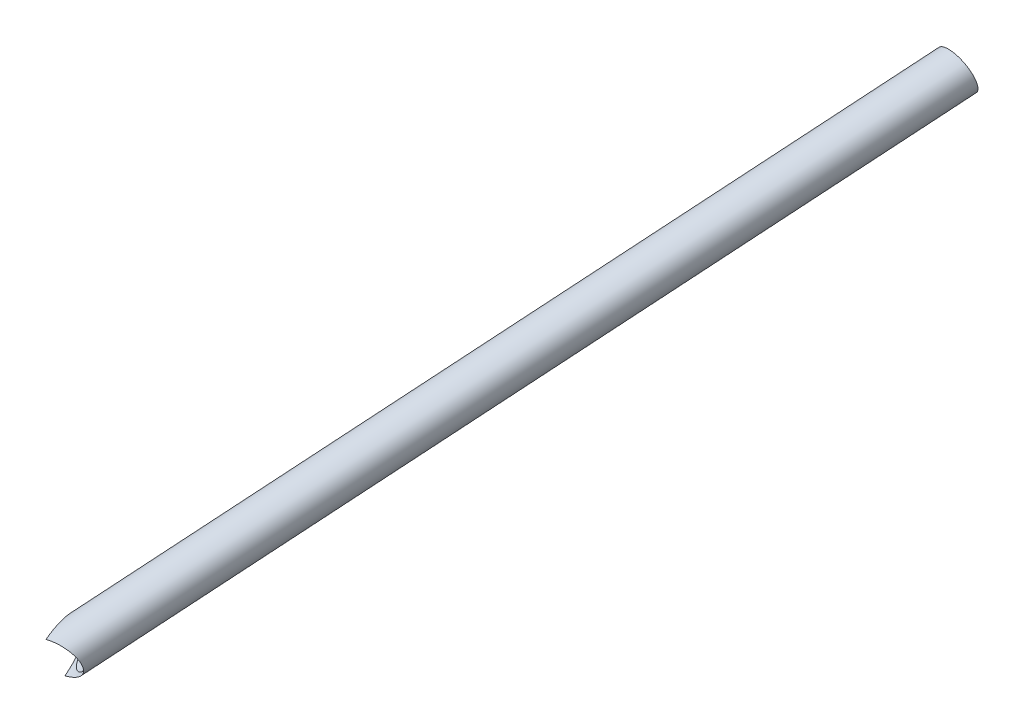
ISO-10303-21;
HEADER;
FILE_DESCRIPTION(('STEP AP214'),'2;1');
FILE_NAME('part.step','',(''),(''),'','','');
FILE_SCHEMA(('AUTOMOTIVE_DESIGN { 1 0 10303 214 1 1 1 1 }'));
ENDSEC;
DATA;
#1=APPLICATION_CONTEXT('core data for automotive mechanical design processes');
#2=APPLICATION_PROTOCOL_DEFINITION('international standard','automotive_design',2000,#1);
#3=PRODUCT_CONTEXT('',#1,'mechanical');
#4=PRODUCT('Part','Part','',(#3));
#5=PRODUCT_RELATED_PRODUCT_CATEGORY('part','',(#4));
#6=PRODUCT_DEFINITION_FORMATION('','',#4);
#7=PRODUCT_DEFINITION_CONTEXT('part definition',#1,'design');
#8=PRODUCT_DEFINITION('design','',#6,#7);
#9=PRODUCT_DEFINITION_SHAPE('','',#8);
#10=(LENGTH_UNIT() NAMED_UNIT(*) SI_UNIT(.MILLI.,.METRE.));
#11=(NAMED_UNIT(*) PLANE_ANGLE_UNIT() SI_UNIT($,.RADIAN.));
#12=(NAMED_UNIT(*) SI_UNIT($,.STERADIAN.) SOLID_ANGLE_UNIT());
#13=UNCERTAINTY_MEASURE_WITH_UNIT(LENGTH_MEASURE(1.E-05),#10,'distance_accuracy_value','');
#14=(GEOMETRIC_REPRESENTATION_CONTEXT(3) GLOBAL_UNCERTAINTY_ASSIGNED_CONTEXT((#13)) GLOBAL_UNIT_ASSIGNED_CONTEXT((#10,
#11,#12)) REPRESENTATION_CONTEXT('',''));
#15=CARTESIAN_POINT('',(0.,0.,0.));
#16=DIRECTION('',(0.,0.,1.));
#17=DIRECTION('',(1.,0.,0.));
#18=AXIS2_PLACEMENT_3D('',#15,#16,#17);
#19=CARTESIAN_POINT('',(-225.,199.999999999997,-200.000000000001));
#20=DIRECTION('',(0.313257210262408,0.388871019636107,-0.866400167535642));
#21=DIRECTION('',(0.,0.912318699307087,0.40948087976684));
#22=AXIS2_PLACEMENT_3D('',#19,#20,#21);
#23=CYLINDRICAL_SURFACE('',#22,11.3);
#24=CARTESIAN_POINT('',(-80.0000000000003,380.000000000003,-601.037933611911));
#25=DIRECTION('',(0.0877040448988896,0.311824264686706,-0.946083309471723));
#26=DIRECTION('',(0.915766996856783,0.348518707826596,0.199763654759292));
#27=AXIS2_PLACEMENT_3D('',#24,#25,#26);
#28=ELLIPSE('',#27,11.6684899557684,11.3);
#29=CARTESIAN_POINT('',(-69.3143819953527,384.066687041675,-598.706993412824));
#30=VERTEX_POINT('',#29);
#31=EDGE_CURVE('E85',#30,#30,#28,.T.);
#32=ORIENTED_EDGE('',*,*,#31,.T.);
#33=EDGE_LOOP('',(#32));
#34=FACE_BOUND('',#33,.T.);
#35=CARTESIAN_POINT('',(-223.170681683834,212.580079211889,-200.43235597197));
#36=CARTESIAN_POINT('',(-223.342960242135,212.642900551134,-200.572308157806));
#37=CARTESIAN_POINT('',(-223.5063247625,212.704324340843,-200.72371246689));
#38=CARTESIAN_POINT('',(-223.815345767516,212.824369890079,-201.044765475674));
#39=CARTESIAN_POINT('',(-223.960983559026,212.882988652811,-201.214433085204));
#40=CARTESIAN_POINT('',(-224.236946514407,212.997663034725,-201.568606781049));
#41=CARTESIAN_POINT('',(-224.367149546055,213.053696310919,-201.753213975834));
#42=CARTESIAN_POINT('',(-224.613304656625,213.16261224097,-202.132409583786));
#43=CARTESIAN_POINT('',(-224.729259438125,213.215495491333,-202.326996094142));
#44=CARTESIAN_POINT('',(-224.97188589708,213.328537163043,-202.764131330896));
#45=CARTESIAN_POINT('',(-225.095886166926,213.387966386511,-203.008338811169));
#46=CARTESIAN_POINT('',(-225.330339153318,213.501989809347,-203.504330851236));
#47=CARTESIAN_POINT('',(-225.440784919299,213.556581524151,-203.756119216677));
#48=CARTESIAN_POINT('',(-225.651055297934,213.66081127532,-204.265605322309));
#49=CARTESIAN_POINT('',(-225.750860548779,213.710440271522,-204.523312831738));
#50=CARTESIAN_POINT('',(-225.94174101524,213.804418331292,-205.042808607497));
#51=CARTESIAN_POINT('',(-226.032817837557,213.84876836696,-205.304596112441));
#52=CARTESIAN_POINT('',(-226.208199036787,213.932126681191,-205.832398121217));
#53=CARTESIAN_POINT('',(-226.292476119537,213.971113835275,-206.098424980178));
#54=CARTESIAN_POINT('',(-226.455083330722,214.043280955442,-206.633074079074));
#55=CARTESIAN_POINT('',(-226.53341324828,214.07646071566,-206.90169641066));
#56=CARTESIAN_POINT('',(-226.684950479747,214.136680179376,-207.440743663664));
#57=CARTESIAN_POINT('',(-226.758163270196,214.16372651892,-207.711166307874));
#58=CARTESIAN_POINT('',(-226.900244887483,214.211391119115,-208.253729450513));
#59=CARTESIAN_POINT('',(-226.969113456219,214.23200899812,-208.525870049955));
#60=CARTESIAN_POINT('',(-227.107894261879,214.267691121499,-209.091412827201));
#61=CARTESIAN_POINT('',(-227.17751664929,214.282240993876,-209.384918836055));
#62=CARTESIAN_POINT('',(-227.312811655067,214.302972285788,-209.973159587268));
#63=CARTESIAN_POINT('',(-227.37848398089,214.309153086232,-210.267894418911));
#64=CARTESIAN_POINT('',(-227.506236823727,214.312534083165,-210.858396063157));
#65=CARTESIAN_POINT('',(-227.568315011136,214.309728519881,-211.154163416209));
#66=CARTESIAN_POINT('',(-227.689037869115,214.294418618149,-211.746124910376));
#67=CARTESIAN_POINT('',(-227.747682874509,214.281915227192,-212.042319006978));
#68=CARTESIAN_POINT('',(-227.861328077719,214.246495111186,-212.633012524707));
#69=CARTESIAN_POINT('',(-227.916347378792,214.223638976933,-212.927511848309));
#70=CARTESIAN_POINT('',(-228.023123854569,214.166599795624,-213.5159803541));
#71=CARTESIAN_POINT('',(-228.07488143364,214.132418155933,-213.8099495976));
#72=CARTESIAN_POINT('',(-228.175036845002,214.05166891956,-214.39652452381));
#73=CARTESIAN_POINT('',(-228.22343735236,214.005111330958,-214.689131114776));
#74=CARTESIAN_POINT('',(-228.316762336355,213.898335938604,-215.272364160373));
#75=CARTESIAN_POINT('',(-228.36168756773,213.838121112078,-215.562991032372));
#76=CARTESIAN_POINT('',(-228.440020542061,213.714814311806,-216.088916059171));
#77=CARTESIAN_POINT('',(-228.474041090138,213.654216136427,-216.324706804013));
#78=CARTESIAN_POINT('',(-228.539389818938,213.521922179066,-216.79353892662));
#79=CARTESIAN_POINT('',(-228.570718166215,213.450227084372,-217.026580473696));
#80=CARTESIAN_POINT('',(-228.630478043049,213.294568365427,-217.489345454793));
#81=CARTESIAN_POINT('',(-228.658904960884,213.210585710604,-217.719063123207));
#82=CARTESIAN_POINT('',(-228.71248472308,213.02927178271,-218.173598072011));
#83=CARTESIAN_POINT('',(-228.737637524947,212.93194033642,-218.398415288767));
#84=CARTESIAN_POINT('',(-228.784527654986,212.721532920552,-218.844025676543));
#85=CARTESIAN_POINT('',(-228.806224458169,212.608295842474,-219.06474758059));
#86=CARTESIAN_POINT('',(-228.845373301333,212.365568087056,-219.497565059594));
#87=CARTESIAN_POINT('',(-228.862824818496,212.236075410772,-219.709659569389));
#88=CARTESIAN_POINT('',(-228.892869738466,211.959944122573,-220.122119384267));
#89=CARTESIAN_POINT('',(-228.905474056623,211.813345015177,-220.322510170728));
#90=CARTESIAN_POINT('',(-228.925244077587,211.501885400407,-220.708841104466));
#91=CARTESIAN_POINT('',(-228.932412681571,211.337034688294,-220.894788912689));
#92=CARTESIAN_POINT('',(-228.939398574621,211.043146661141,-221.193353255568));
#93=CARTESIAN_POINT('',(-228.940811634,210.91898234303,-221.310748531268));
#94=CARTESIAN_POINT('',(-228.940588806732,210.662044687618,-221.535679689023));
#95=CARTESIAN_POINT('',(-228.93895378136,210.529273792444,-221.643218347181));
#96=CARTESIAN_POINT('',(-228.932493540919,210.255608758685,-221.847110997192));
#97=CARTESIAN_POINT('',(-228.927670631953,210.114720559331,-221.943473015));
#98=CARTESIAN_POINT('',(-228.914751243764,209.825422883865,-222.123938003776));
#99=CARTESIAN_POINT('',(-228.906654715854,209.67701329592,-222.208040792393));
#100=CARTESIAN_POINT('',(-228.887140197008,209.373078030602,-222.36331557894));
#101=CARTESIAN_POINT('',(-228.875709945831,209.217527904822,-222.434438242134));
#102=CARTESIAN_POINT('',(-228.84961127769,208.90103169574,-222.562706789619));
#103=CARTESIAN_POINT('',(-228.834942861973,208.740085614519,-222.619852679303));
#104=CARTESIAN_POINT('',(-228.802512163356,208.414066585077,-222.719900984726));
#105=CARTESIAN_POINT('',(-228.784748620116,208.248991979259,-222.762797577376));
#106=CARTESIAN_POINT('',(-228.746347064615,207.916136659426,-222.834407939124));
#107=CARTESIAN_POINT('',(-228.725709017533,207.748355912653,-222.863121536398));
#108=CARTESIAN_POINT('',(-228.682688426654,207.418067217901,-222.905925142407));
#109=CARTESIAN_POINT('',(-228.66040772639,207.255614519192,-222.9205506698));
#110=CARTESIAN_POINT('',(-228.613673234366,206.930358901844,-222.937730676728));
#111=CARTESIAN_POINT('',(-228.589218733852,206.767555885994,-222.940281204473));
#112=CARTESIAN_POINT('',(-228.512977437117,206.280037008397,-222.930912298448));
#113=CARTESIAN_POINT('',(-228.458292533268,205.956057194704,-222.901990817121));
#114=CARTESIAN_POINT('',(-228.303975430701,205.098209724221,-222.772873462301));
#115=CARTESIAN_POINT('',(-228.198960943903,204.570606414374,-222.637698782022));
#116=CARTESIAN_POINT('',(-228.033507162766,203.801954027345,-222.37574393968));
#117=CARTESIAN_POINT('',(-227.976919509919,203.549072857679,-222.278319944784));
#118=CARTESIAN_POINT('',(-227.861504026765,203.051047442892,-222.066462541915));
#119=CARTESIAN_POINT('',(-227.802676667009,202.805901592196,-221.952032692278));
#120=CARTESIAN_POINT('',(-227.638542933763,202.143455461426,-221.61787953157));
#121=CARTESIAN_POINT('',(-227.531299153119,201.734144172336,-221.383285489882));
#122=CARTESIAN_POINT('',(-227.312094123585,200.938360328336,-220.879891269383));
#123=CARTESIAN_POINT('',(-227.200129104218,200.551906643207,-220.611063390933));
#124=CARTESIAN_POINT('',(-226.971564870672,199.799631015759,-220.04562376045));
#125=CARTESIAN_POINT('',(-226.854953172045,199.433872080444,-219.748933782168));
#126=CARTESIAN_POINT('',(-226.617288017231,198.72297308089,-219.133812665823));
#127=CARTESIAN_POINT('',(-226.496236040674,198.377826247074,-218.815388740229));
#128=CARTESIAN_POINT('',(-226.287092252018,197.810282923899,-218.261527509891));
#129=CARTESIAN_POINT('',(-226.20033198394,197.582820905688,-218.030736749171));
#130=CARTESIAN_POINT('',(-226.023979506756,197.136901163313,-217.561627096661));
#131=CARTESIAN_POINT('',(-225.934387120833,196.918444003318,-217.32330773484));
#132=CARTESIAN_POINT('',(-225.751795050186,196.49020971041,-216.839896453059));
#133=CARTESIAN_POINT('',(-225.658792638616,196.280439822894,-216.594799153348));
#134=CARTESIAN_POINT('',(-225.46874903675,195.869722692473,-216.098864339946));
#135=CARTESIAN_POINT('',(-225.371708009643,195.668775093757,-215.848027058375));
#136=CARTESIAN_POINT('',(-225.172913133666,195.276360561313,-215.342132300365));
#137=CARTESIAN_POINT('',(-225.071173710046,195.084867915157,-215.087089109609));
#138=CARTESIAN_POINT('',(-224.86141331789,194.71102459382,-214.572853956956));
#139=CARTESIAN_POINT('',(-224.753391630782,194.528674968886,-214.313661522933));
#140=CARTESIAN_POINT('',(-224.529423762548,194.173961889095,-213.792379342752));
#141=CARTESIAN_POINT('',(-224.413487197619,194.001586770305,-213.53029342565));
#142=CARTESIAN_POINT('',(-224.171141364839,193.667684953005,-213.004112633604));
#143=CARTESIAN_POINT('',(-224.044735342135,193.506154920816,-212.740018404043));
#144=CARTESIAN_POINT('',(-223.821856478748,193.2468237412,-212.298376862104));
#145=CARTESIAN_POINT('',(-223.729218458769,193.145540381184,-212.120942294788));
#146=CARTESIAN_POINT('',(-223.536264365094,192.949523284265,-211.766564881264));
#147=CARTESIAN_POINT('',(-223.435947615263,192.854790125527,-211.589622079783));
#148=CARTESIAN_POINT('',(-223.226083929592,192.673155563582,-211.237361735224));
#149=CARTESIAN_POINT('',(-223.116543896414,192.58624840249,-211.062043083821));
#150=CARTESIAN_POINT('',(-222.886279568542,192.421875613855,-210.714312057763));
#151=CARTESIAN_POINT('',(-222.765558211359,192.344407518832,-210.54189893377));
#152=CARTESIAN_POINT('',(-222.541973102851,192.218628870217,-210.243354061889));
#153=CARTESIAN_POINT('',(-222.441922242265,192.167812420243,-210.116178670159));
#154=CARTESIAN_POINT('',(-222.233572116505,192.074108055753,-209.865746713105));
#155=CARTESIAN_POINT('',(-222.125275862775,192.031217265997,-209.742488740124));
#156=CARTESIAN_POINT('',(-221.900221955246,191.954786808172,-209.501434823198));
#157=CARTESIAN_POINT('',(-221.783485779474,191.921224388161,-209.383626184457));
#158=CARTESIAN_POINT('',(-221.541354717582,191.86465351547,-209.154518098522));
#159=CARTESIAN_POINT('',(-221.415960523741,191.841644220103,-209.043218132217));
#160=CARTESIAN_POINT('',(-221.155974814233,191.807139719351,-208.827347127974));
#161=CARTESIAN_POINT('',(-221.021308719074,191.79575339334,-208.722848154154));
#162=CARTESIAN_POINT('',(-220.745190474229,191.785568547066,-208.522572809689));
#163=CARTESIAN_POINT('',(-220.603738361985,191.786769957357,-208.426796390924));
#164=CARTESIAN_POINT('',(-220.315589918066,191.801884954452,-208.24402980575));
#165=CARTESIAN_POINT('',(-220.168884589267,191.815821461781,-208.157055795449));
#166=CARTESIAN_POINT('',(-219.872380624923,191.856014023932,-207.991673301959));
#167=CARTESIAN_POINT('',(-219.722581392006,191.882272479543,-207.913266491664));
#168=CARTESIAN_POINT('',(-219.383645848075,191.954435217648,-207.74530760191));
#169=CARTESIAN_POINT('',(-219.194129402674,192.003626254279,-207.657941708114));
#170=CARTESIAN_POINT('',(-218.815792850038,192.118305970437,-207.493024699053));
#171=CARTESIAN_POINT('',(-218.626973000336,192.183800163204,-207.415476917392));
#172=CARTESIAN_POINT('',(-218.251558203018,192.329488301445,-207.267691181612));
#173=CARTESIAN_POINT('',(-218.064970576846,192.409721183046,-207.197473380839));
#174=CARTESIAN_POINT('',(-217.695970930957,192.583210905099,-207.06250890079));
#175=CARTESIAN_POINT('',(-217.513559019031,192.676468081315,-206.997762362632));
#176=CARTESIAN_POINT('',(-217.063109260417,192.9247959573,-206.8401883534));
#177=CARTESIAN_POINT('',(-216.798338637812,193.087303277096,-206.749687730052));
#178=CARTESIAN_POINT('',(-216.283146816866,193.435531388196,-206.572448805486));
#179=CARTESIAN_POINT('',(-216.032731600422,193.621261755458,-206.48571207629));
#180=CARTESIAN_POINT('',(-215.548401618357,194.013310853617,-206.312842377291));
#181=CARTESIAN_POINT('',(-215.314485174932,194.219627485873,-206.226709346902));
#182=CARTESIAN_POINT('',(-214.865040443627,194.650703609864,-206.05281908366));
#183=CARTESIAN_POINT('',(-214.649509625683,194.875460555629,-205.965062076314));
#184=CARTESIAN_POINT('',(-214.235118265777,195.345497928268,-205.784862995228));
#185=CARTESIAN_POINT('',(-214.036602191931,195.591061646515,-205.692366723533));
#186=CARTESIAN_POINT('',(-213.662285631084,196.097395018066,-205.503033066592));
#187=CARTESIAN_POINT('',(-213.486486037573,196.35816526889,-205.406195510794));
#188=CARTESIAN_POINT('',(-213.159508638542,196.892805330251,-205.207597497309));
#189=CARTESIAN_POINT('',(-213.008321485008,197.166670116002,-205.105838927801));
#190=CARTESIAN_POINT('',(-212.732241081247,197.725454204488,-204.897106273494));
#191=CARTESIAN_POINT('',(-212.607346834682,198.010373087857,-204.790132386513));
#192=CARTESIAN_POINT('',(-212.38730306683,198.584112212358,-204.572858518292));
#193=CARTESIAN_POINT('',(-212.291689797677,198.872786871144,-204.462644414623));
#194=CARTESIAN_POINT('',(-212.128715324149,199.456243189862,-204.237536600799));
#195=CARTESIAN_POINT('',(-212.061354142278,199.751024854658,-204.122642886918));
#196=CARTESIAN_POINT('',(-211.95591051054,200.344080858844,-203.888767112478));
#197=CARTESIAN_POINT('',(-211.917818763466,200.642354058586,-203.769786362691));
#198=CARTESIAN_POINT('',(-211.87153417881,201.23985433393,-203.528468522592));
#199=CARTESIAN_POINT('',(-211.863339186242,201.539081339226,-203.406131674831));
#200=CARTESIAN_POINT('',(-211.87653877218,202.112187412112,-203.168836083546));
#201=CARTESIAN_POINT('',(-211.895641651868,202.386197397741,-203.054060203361));
#202=CARTESIAN_POINT('',(-211.959262436991,202.930727427109,-202.823311094788));
#203=CARTESIAN_POINT('',(-212.003778816456,203.201247679394,-202.7073379387));
#204=CARTESIAN_POINT('',(-212.117782745231,203.736806917847,-202.475135748982));
#205=CARTESIAN_POINT('',(-212.187266766456,204.001846672851,-202.358906753808));
#206=CARTESIAN_POINT('',(-212.350486829017,204.524666855661,-202.127162123956));
#207=CARTESIAN_POINT('',(-212.444223092394,204.78244721698,-202.011646495819));
#208=CARTESIAN_POINT('',(-212.653228102662,205.284904081674,-201.784260869093));
#209=CARTESIAN_POINT('',(-212.768114680182,205.52972687173,-201.672362176311));
#210=CARTESIAN_POINT('',(-213.019281606722,206.009395310973,-201.451265055256));
#211=CARTESIAN_POINT('',(-213.155561571,206.244241139489,-201.342066578462));
#212=CARTESIAN_POINT('',(-213.448259444019,206.702824882365,-201.127403328784));
#213=CARTESIAN_POINT('',(-213.604678064656,206.92656240366,-201.021938688057));
#214=CARTESIAN_POINT('',(-213.936289780601,207.362009311404,-200.81582388632));
#215=CARTESIAN_POINT('',(-214.111483465513,207.573718319793,-200.715173876649));
#216=CARTESIAN_POINT('',(-214.489649095384,207.996055536156,-200.514294370473));
#217=CARTESIAN_POINT('',(-214.693632416416,208.205943180329,-200.414411664289));
#218=CARTESIAN_POINT('',(-215.119285085773,208.610985540279,-200.222765768361));
#219=CARTESIAN_POINT('',(-215.340955793911,208.806139121046,-200.131003204044));
#220=CARTESIAN_POINT('',(-215.800489914933,209.181623663804,-199.95720772239));
#221=CARTESIAN_POINT('',(-216.038369197597,209.36193970581,-199.87518456274));
#222=CARTESIAN_POINT('',(-216.528387221381,209.707532715372,-199.723016236886));
#223=CARTESIAN_POINT('',(-216.780524328766,209.872811400348,-199.652869713459));
#224=CARTESIAN_POINT('',(-217.27219007599,210.173309176756,-199.53314275796));
#225=CARTESIAN_POINT('',(-217.510563703626,210.309888624578,-199.482226338904));
#226=CARTESIAN_POINT('',(-217.99616684542,210.571552867318,-199.394624426956));
#227=CARTESIAN_POINT('',(-218.243397908079,210.696635638565,-199.357941435815));
#228=CARTESIAN_POINT('',(-218.744594355113,210.935785999979,-199.302091431748));
#229=CARTESIAN_POINT('',(-218.99854803144,211.049871316944,-199.282895794031));
#230=CARTESIAN_POINT('',(-219.511322554295,211.26820961067,-199.266155850791));
#231=CARTESIAN_POINT('',(-219.770140224466,211.372468753794,-199.268597874001));
#232=CARTESIAN_POINT('',(-220.187274653101,211.533150961143,-199.294229949482));
#233=CARTESIAN_POINT('',(-220.3450943396,211.592264321469,-199.308884499916));
#234=CARTESIAN_POINT('',(-220.660275245206,211.707700524058,-199.349516116731));
#235=CARTESIAN_POINT('',(-220.817636603339,211.764024319174,-199.375489286806));
#236=CARTESIAN_POINT('',(-221.130316957538,211.874136472981,-199.440070363355));
#237=CARTESIAN_POINT('',(-221.285639451023,211.927929746328,-199.478652515248));
#238=CARTESIAN_POINT('',(-221.592883629115,212.033409526939,-199.569603271109));
#239=CARTESIAN_POINT('',(-221.744806202134,212.085096587531,-199.621968226844));
#240=CARTESIAN_POINT('',(-222.123221935524,212.213798876031,-199.773193597915));
#241=CARTESIAN_POINT('',(-222.346284099892,212.28962429975,-199.881957906836));
#242=CARTESIAN_POINT('',(-222.773507133728,212.437574952506,-200.133166675982));
#243=CARTESIAN_POINT('',(-222.977687725991,212.509704006655,-200.275575427021));
#244=CARTESIAN_POINT('',(-223.170681683834,212.580079211889,-200.43235597197));
#245=B_SPLINE_CURVE_WITH_KNOTS('',3,(#35,#36,#37,#38,#39,#40,#41,#42,#43,#44,#45,#46,#47,#48,
#49,#50,#51,#52,#53,#54,#55,#56,#57,#58,#59,#60,#61,#62,#63,#64,#65,#66,#67,#68,#69,#70,#71,#72,
#73,#74,#75,#76,#77,#78,#79,#80,#81,#82,#83,#84,#85,#86,#87,#88,#89,#90,#91,#92,#93,#94,#95,#96,
#97,#98,#99,#100,#101,#102,#103,#104,#105,#106,#107,#108,#109,#110,#111,#112,#113,#114,#115,
#116,#117,#118,#119,#120,#121,#122,#123,#124,#125,#126,#127,#128,#129,#130,#131,#132,#133,#134,
#135,#136,#137,#138,#139,#140,#141,#142,#143,#144,#145,#146,#147,#148,#149,#150,#151,#152,#153,
#154,#155,#156,#157,#158,#159,#160,#161,#162,#163,#164,#165,#166,#167,#168,#169,#170,#171,#172,
#173,#174,#175,#176,#177,#178,#179,#180,#181,#182,#183,#184,#185,#186,#187,#188,#189,#190,#191,
#192,#193,#194,#195,#196,#197,#198,#199,#200,#201,#202,#203,#204,#205,#206,#207,#208,#209,#210,
#211,#212,#213,#214,#215,#216,#217,#218,#219,#220,#221,#222,#223,#224,#225,#226,#227,#228,#229,
#230,#231,#232,#233,#234,#235,#236,#237,#238,#239,#240,#241,#242,#243,#244),.UNSPECIFIED.,.T.,
.F.,(4,2,2,2,2,2,2,2,2,2,2,2,2,2,2,2,2,2,2,2,2,2,2,2,2,2,2,2,2,2,2,2,2,2,2,2,2,2,2,2,2,2,2,2,2,
2,2,2,2,2,2,2,2,2,2,2,2,2,2,2,2,2,2,2,2,2,2,2,2,2,2,2,2,2,2,2,2,2,2,2,2,2,2,2,2,2,2,2,2,2,2,2,2,
2,2,2,2,2,2,2,2,2,2,2,4),(0.,0.691546780640594,1.38381660488106,2.08124264683104,
2.7785361975819,3.61868724998865,4.45926733615982,5.30135176051445,6.14328087765865,
6.98843680366239,7.83362268354108,8.67788970604781,9.52220684186545,10.4280687954132,
11.3339977551632,12.2405074825219,13.1469286538375,14.0481120839193,14.9491835703599,
15.8495285909413,16.7496775280834,17.4868872219072,18.2240512748945,18.9623693519618,
19.7006970106269,20.4471297680576,21.1936544040341,21.9384879660164,22.6829237112378,
23.1951005100199,23.707132608765,24.2187947099949,24.7304644211924,25.2440401232907,
25.7576156272397,26.271400750461,26.7851920979119,27.2785768791694,27.7721231194251,
28.758750475834,30.4127594644205,31.2429046039111,32.0728762862469,33.5219579987211,
34.9722197472141,36.4266824911679,37.8806648927047,38.8868277047145,39.8930534587999,
40.9001021895537,41.9071102677247,42.9112091045056,43.9154230177495,44.9184378564048,
45.9211429525074,46.5939482171821,47.2668127925851,47.9391782005322,48.6113674657624,
49.1198232053308,49.6280941255952,50.1351142689134,50.6420939186468,51.1537803390279,
51.6654639364334,52.1780702755988,52.6907765316912,53.3329670990684,53.9753751318933,
54.6195053195564,55.2636521158514,56.2330193663378,57.2027876590869,58.1724571908863,
59.141993069427,60.1279619500192,61.11396959917,62.0996018761192,63.0851967969804,
64.0542612394556,65.0233264537954,65.9920837247217,66.9607711653507,67.852751947335,
68.7446791754031,69.6364804180579,70.5282898258527,71.4053350033722,72.2823644098186,
73.1594248275515,74.036512796186,74.9632848290755,75.89012818141,76.817892418937,
77.7455505630028,78.5830810091558,79.4207585979847,80.2570625279693,81.0928380958546,
81.5999931705835,82.1069738006296,82.6129252984448,83.118743008096,83.8942633300486,
84.6689642071999),.UNSPECIFIED.);
#246=CARTESIAN_POINT('',(-223.170681683834,212.580079211889,-200.43235597197));
#247=VERTEX_POINT('',#246);
#248=EDGE_CURVE('E79',#247,#247,#245,.T.);
#249=ORIENTED_EDGE('',*,*,#248,.T.);
#250=EDGE_LOOP('',(#249));
#251=FACE_BOUND('',#250,.T.);
#252=ADVANCED_FACE('F41',(#34,#251),#23,.F.);
#253=CARTESIAN_POINT('',(-80.0000000000002,380.000000000003,-601.037933611911));
#254=DIRECTION('',(0.0877040448988896,0.311824264686706,-0.946083309471723));
#255=DIRECTION('',(0.,0.949743072396229,0.313030504001401));
#256=AXIS2_PLACEMENT_3D('',#253,#254,#255);
#257=PLANE('',#256);
#258=ORIENTED_EDGE('',*,*,#31,.F.);
#259=EDGE_LOOP('',(#258));
#260=FACE_BOUND('',#259,.T.);
#261=CARTESIAN_POINT('',(-80.0000000000003,380.000000000003,-601.037933611911));
#262=DIRECTION('',(0.0877040448988896,0.311824264686706,-0.946083309471723));
#263=DIRECTION('',(0.915766996856783,0.348518707826596,0.199763654759292));
#264=AXIS2_PLACEMENT_3D('',#261,#262,#263);
#265=ELLIPSE('',#264,12.9076216324872,12.5);
#266=CARTESIAN_POINT('',(-68.1796261010538,384.498547612472,-598.459459940355));
#267=VERTEX_POINT('',#266);
#268=EDGE_CURVE('E57',#267,#267,#265,.T.);
#269=ORIENTED_EDGE('',*,*,#268,.T.);
#270=EDGE_LOOP('',(#269));
#271=FACE_BOUND('',#270,.T.);
#272=ADVANCED_FACE('F43',(#260,#271),#257,.T.);
#273=CARTESIAN_POINT('',(-225.,199.999999999997,-200.000000000001));
#274=DIRECTION('',(0.313257210262408,0.388871019636107,-0.866400167535642));
#275=DIRECTION('',(0.,0.912318699307087,0.40948087976684));
#276=AXIS2_PLACEMENT_3D('',#273,#274,#275);
#277=CYLINDRICAL_SURFACE('',#276,12.5);
#278=ORIENTED_EDGE('',*,*,#268,.F.);
#279=EDGE_LOOP('',(#278));
#280=FACE_BOUND('',#279,.T.);
#281=CARTESIAN_POINT('',(-225.,199.999999999997,-200.000000000001));
#282=DIRECTION('',(0.979997411230481,0.138387159755206,-0.143017719169491));
#283=DIRECTION('',(-0.184942384206691,0.367901037751937,-0.91128762799952));
#284=AXIS2_PLACEMENT_3D('',#281,#282,#283);
#285=ELLIPSE('',#284,25.7882654286992,12.5);
#286=CARTESIAN_POINT('',(-225.918676740744,211.493869428658,-195.173303551818));
#287=VERTEX_POINT('',#286);
#288=CARTESIAN_POINT('',(-224.081323259255,188.506130571336,-204.826696448184));
#289=VERTEX_POINT('',#288);
#290=EDGE_CURVE('E11',#287,#289,#285,.F.);
#291=ORIENTED_EDGE('',*,*,#290,.F.);
#292=CARTESIAN_POINT('',(-225.,199.999999999997,-200.000000000001));
#293=DIRECTION('',(-0.184942384206691,0.367901037751937,-0.91128762799952));
#294=DIRECTION('',(0.979997411230481,0.138387159755206,-0.143017719169491));
#295=AXIS2_PLACEMENT_3D('',#292,#293,#294);
#296=ELLIPSE('',#295,14.291083324664,12.5);
#297=EDGE_CURVE('E49',#289,#287,#296,.F.);
#298=ORIENTED_EDGE('',*,*,#297,.F.);
#299=EDGE_LOOP('',(#291,#298));
#300=FACE_BOUND('',#299,.T.);
#301=ADVANCED_FACE('F58',(#280,#300),#277,.T.);
#302=CARTESIAN_POINT('',(-225.,199.999999999997,-200.000000000001));
#303=DIRECTION('',(0.636784790371593,-0.254713916148644,0.72775404613896));
#304=DIRECTION('',(0.752576694706879,0.,-0.658504607868517));
#305=AXIS2_PLACEMENT_3D('',#302,#303,#304);
#306=CYLINDRICAL_SURFACE('',#305,12.5);
#307=ORIENTED_EDGE('',*,*,#248,.F.);
#308=EDGE_LOOP('',(#307));
#309=FACE_BOUND('',#308,.T.);
#310=ORIENTED_EDGE('',*,*,#290,.T.);
#311=ORIENTED_EDGE('',*,*,#297,.T.);
#312=EDGE_LOOP('',(#310,#311));
#313=FACE_BOUND('',#312,.T.);
#314=ADVANCED_FACE('F55',(#309,#313),#306,.F.);
#315=CLOSED_SHELL('',(#252,#272,#301,#314));
#316=MANIFOLD_SOLID_BREP('B2',#315);
#317=ADVANCED_BREP_SHAPE_REPRESENTATION('',(#18,#316),#14);
#318=SHAPE_DEFINITION_REPRESENTATION(#9,#317);
ENDSEC;
END-ISO-10303-21;
